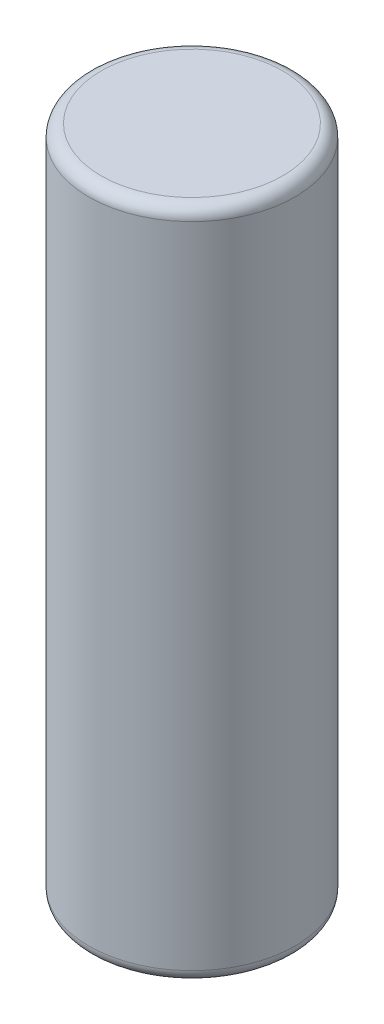
ISO-10303-21;
HEADER;
FILE_DESCRIPTION(('STEP AP214'),'2;1');
FILE_NAME('part.step','',(''),(''),'','','');
FILE_SCHEMA(('AUTOMOTIVE_DESIGN { 1 0 10303 214 1 1 1 1 }'));
ENDSEC;
DATA;
#1=APPLICATION_CONTEXT('core data for automotive mechanical design processes');
#2=APPLICATION_PROTOCOL_DEFINITION('international standard','automotive_design',2000,#1);
#3=PRODUCT_CONTEXT('',#1,'mechanical');
#4=PRODUCT('Part','Part','',(#3));
#5=PRODUCT_RELATED_PRODUCT_CATEGORY('part','',(#4));
#6=PRODUCT_DEFINITION_FORMATION('','',#4);
#7=PRODUCT_DEFINITION_CONTEXT('part definition',#1,'design');
#8=PRODUCT_DEFINITION('design','',#6,#7);
#9=PRODUCT_DEFINITION_SHAPE('','',#8);
#10=(LENGTH_UNIT() NAMED_UNIT(*) SI_UNIT(.MILLI.,.METRE.));
#11=(NAMED_UNIT(*) PLANE_ANGLE_UNIT() SI_UNIT($,.RADIAN.));
#12=(NAMED_UNIT(*) SI_UNIT($,.STERADIAN.) SOLID_ANGLE_UNIT());
#13=UNCERTAINTY_MEASURE_WITH_UNIT(LENGTH_MEASURE(1.E-05),#10,'distance_accuracy_value','');
#14=(GEOMETRIC_REPRESENTATION_CONTEXT(3) GLOBAL_UNCERTAINTY_ASSIGNED_CONTEXT((#13)) GLOBAL_UNIT_ASSIGNED_CONTEXT((#10,
#11,#12)) REPRESENTATION_CONTEXT('',''));
#15=CARTESIAN_POINT('',(0.,0.,0.));
#16=DIRECTION('',(0.,0.,1.));
#17=DIRECTION('',(1.,0.,0.));
#18=AXIS2_PLACEMENT_3D('',#15,#16,#17);
#19=CARTESIAN_POINT('',(0.,69.85,0.));
#20=DIRECTION('',(0.,-1.,0.));
#21=DIRECTION('',(0.,0.,-1.));
#22=AXIS2_PLACEMENT_3D('',#19,#20,#21);
#23=CYLINDRICAL_SURFACE('',#22,10.700004);
#24=CARTESIAN_POINT('',(0.,1.26999999999999,0.));
#25=DIRECTION('',(0.,1.,0.));
#26=DIRECTION('',(0.,0.,1.));
#27=AXIS2_PLACEMENT_3D('',#24,#25,#26);
#28=CIRCLE('',#27,10.700004);
#29=CARTESIAN_POINT('',(0.,1.26999999999999,10.700004));
#30=VERTEX_POINT('',#29);
#31=EDGE_CURVE('E60',#30,#30,#28,.T.);
#32=ORIENTED_EDGE('',*,*,#31,.T.);
#33=EDGE_LOOP('',(#32));
#34=FACE_BOUND('',#33,.T.);
#35=CARTESIAN_POINT('',(0.,68.58,0.));
#36=DIRECTION('',(0.,1.,0.));
#37=DIRECTION('',(0.,0.,1.));
#38=AXIS2_PLACEMENT_3D('',#35,#36,#37);
#39=CIRCLE('',#38,10.700004);
#40=CARTESIAN_POINT('',(0.,68.58,10.700004));
#41=VERTEX_POINT('',#40);
#42=EDGE_CURVE('E65',#41,#41,#39,.F.);
#43=ORIENTED_EDGE('',*,*,#42,.T.);
#44=EDGE_LOOP('',(#43));
#45=FACE_BOUND('',#44,.T.);
#46=ADVANCED_FACE('F47',(#34,#45),#23,.T.);
#47=CARTESIAN_POINT('',(0.,69.85,0.));
#48=DIRECTION('',(0.,1.,0.));
#49=DIRECTION('',(0.,0.,1.));
#50=AXIS2_PLACEMENT_3D('',#47,#48,#49);
#51=PLANE('',#50);
#52=CARTESIAN_POINT('',(0.,69.85,0.));
#53=DIRECTION('',(0.,1.,0.));
#54=DIRECTION('',(0.,0.,1.));
#55=AXIS2_PLACEMENT_3D('',#52,#53,#54);
#56=CIRCLE('',#55,9.430004);
#57=CARTESIAN_POINT('',(0.,69.85,9.430004));
#58=VERTEX_POINT('',#57);
#59=EDGE_CURVE('E10',#58,#58,#56,.T.);
#60=ORIENTED_EDGE('',*,*,#59,.T.);
#61=EDGE_LOOP('',(#60));
#62=FACE_BOUND('',#61,.T.);
#63=ADVANCED_FACE('F82',(#62),#51,.T.);
#64=CARTESIAN_POINT('',(0.,0.,0.));
#65=DIRECTION('',(0.,1.,0.));
#66=DIRECTION('',(0.,0.,1.));
#67=AXIS2_PLACEMENT_3D('',#64,#65,#66);
#68=PLANE('',#67);
#69=CARTESIAN_POINT('',(0.,0.,0.));
#70=DIRECTION('',(0.,1.,0.));
#71=DIRECTION('',(0.,0.,1.));
#72=AXIS2_PLACEMENT_3D('',#69,#70,#71);
#73=CIRCLE('',#72,9.430004);
#74=CARTESIAN_POINT('',(0.,0.,9.430004));
#75=VERTEX_POINT('',#74);
#76=EDGE_CURVE('E55',#75,#75,#73,.F.);
#77=ORIENTED_EDGE('',*,*,#76,.T.);
#78=EDGE_LOOP('',(#77));
#79=FACE_BOUND('',#78,.T.);
#80=ADVANCED_FACE('F79',(#79),#68,.F.);
#81=CARTESIAN_POINT('',(0.,1.26999999999999,0.));
#82=DIRECTION('',(0.,1.,0.));
#83=DIRECTION('',(0.,0.,1.));
#84=AXIS2_PLACEMENT_3D('',#81,#82,#83);
#85=TOROIDAL_SURFACE('',#84,9.430004,1.27);
#86=ORIENTED_EDGE('',*,*,#76,.F.);
#87=EDGE_LOOP('',(#86));
#88=FACE_BOUND('',#87,.T.);
#89=ORIENTED_EDGE('',*,*,#31,.F.);
#90=EDGE_LOOP('',(#89));
#91=FACE_BOUND('',#90,.T.);
#92=ADVANCED_FACE('F75',(#88,#91),#85,.T.);
#93=CARTESIAN_POINT('',(0.,68.58,0.));
#94=DIRECTION('',(0.,1.,0.));
#95=DIRECTION('',(0.,0.,1.));
#96=AXIS2_PLACEMENT_3D('',#93,#94,#95);
#97=TOROIDAL_SURFACE('',#96,9.430004,1.27);
#98=ORIENTED_EDGE('',*,*,#42,.F.);
#99=EDGE_LOOP('',(#98));
#100=FACE_BOUND('',#99,.T.);
#101=ORIENTED_EDGE('',*,*,#59,.F.);
#102=EDGE_LOOP('',(#101));
#103=FACE_BOUND('',#102,.T.);
#104=ADVANCED_FACE('F49',(#100,#103),#97,.T.);
#105=CLOSED_SHELL('',(#46,#63,#80,#92,#104));
#106=MANIFOLD_SOLID_BREP('B2',#105);
#107=ADVANCED_BREP_SHAPE_REPRESENTATION('',(#18,#106),#14);
#108=SHAPE_DEFINITION_REPRESENTATION(#9,#107);
ENDSEC;
END-ISO-10303-21;
